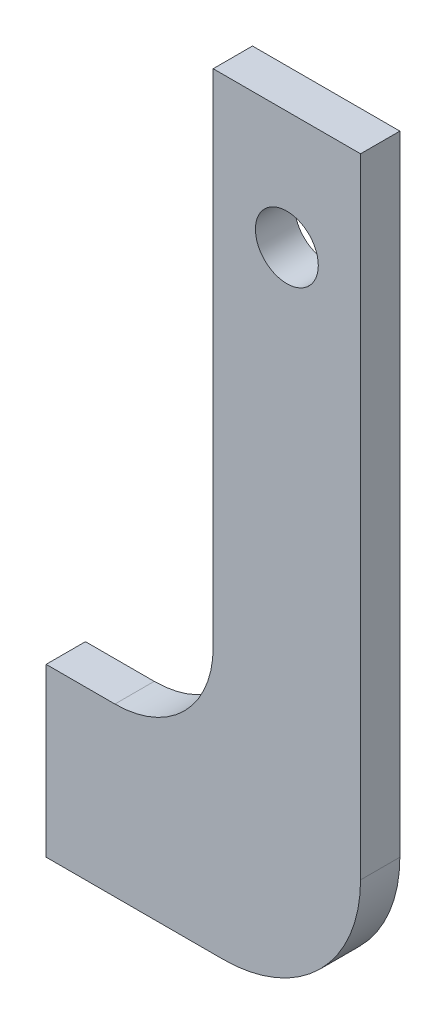
ISO-10303-21;
HEADER;
FILE_DESCRIPTION(('STEP AP214'),'2;1');
FILE_NAME('part.step','',(''),(''),'','','');
FILE_SCHEMA(('AUTOMOTIVE_DESIGN { 1 0 10303 214 1 1 1 1 }'));
ENDSEC;
DATA;
#1=APPLICATION_CONTEXT('core data for automotive mechanical design processes');
#2=APPLICATION_PROTOCOL_DEFINITION('international standard','automotive_design',2000,#1);
#3=PRODUCT_CONTEXT('',#1,'mechanical');
#4=PRODUCT('Part','Part','',(#3));
#5=PRODUCT_RELATED_PRODUCT_CATEGORY('part','',(#4));
#6=PRODUCT_DEFINITION_FORMATION('','',#4);
#7=PRODUCT_DEFINITION_CONTEXT('part definition',#1,'design');
#8=PRODUCT_DEFINITION('design','',#6,#7);
#9=PRODUCT_DEFINITION_SHAPE('','',#8);
#10=(LENGTH_UNIT() NAMED_UNIT(*) SI_UNIT(.MILLI.,.METRE.));
#11=(NAMED_UNIT(*) PLANE_ANGLE_UNIT() SI_UNIT($,.RADIAN.));
#12=(NAMED_UNIT(*) SI_UNIT($,.STERADIAN.) SOLID_ANGLE_UNIT());
#13=UNCERTAINTY_MEASURE_WITH_UNIT(LENGTH_MEASURE(1.E-05),#10,'distance_accuracy_value','');
#14=(GEOMETRIC_REPRESENTATION_CONTEXT(3) GLOBAL_UNCERTAINTY_ASSIGNED_CONTEXT((#13)) GLOBAL_UNIT_ASSIGNED_CONTEXT((#10,
#11,#12)) REPRESENTATION_CONTEXT('',''));
#15=CARTESIAN_POINT('',(0.,0.,0.));
#16=DIRECTION('',(0.,0.,1.));
#17=DIRECTION('',(1.,0.,0.));
#18=AXIS2_PLACEMENT_3D('',#15,#16,#17);
#19=CARTESIAN_POINT('',(0.,-9.7809667673716,2.));
#20=DIRECTION('',(0.,1.,0.));
#21=DIRECTION('',(0.,0.,1.));
#22=AXIS2_PLACEMENT_3D('',#19,#20,#21);
#23=PLANE('',#22);
#24=DIRECTION('',(1.,0.,0.));
#25=VECTOR('',#24,1.);
#26=CARTESIAN_POINT('',(0.,-9.7809667673716,0.));
#27=LINE('',#26,#25);
#28=CARTESIAN_POINT('',(-11.238670694864,-9.7809667673716,0.));
#29=VERTEX_POINT('',#28);
#30=CARTESIAN_POINT('',(-2.2386706948641,-9.7809667673716,0.));
#31=VERTEX_POINT('',#30);
#32=EDGE_CURVE('E143',#29,#31,#27,.T.);
#33=ORIENTED_EDGE('',*,*,#32,.T.);
#34=DIRECTION('',(0.,0.,-1.));
#35=VECTOR('',#34,1.);
#36=CARTESIAN_POINT('',(-2.2386706948641,-9.7809667673716,2.));
#37=LINE('',#36,#35);
#38=CARTESIAN_POINT('',(-2.2386706948641,-9.7809667673716,2.));
#39=VERTEX_POINT('',#38);
#40=EDGE_CURVE('E11',#39,#31,#37,.T.);
#41=ORIENTED_EDGE('',*,*,#40,.F.);
#42=DIRECTION('',(1.,0.,0.));
#43=VECTOR('',#42,1.);
#44=CARTESIAN_POINT('',(0.,-9.7809667673716,2.));
#45=LINE('',#44,#43);
#46=CARTESIAN_POINT('',(-11.238670694864,-9.7809667673716,2.));
#47=VERTEX_POINT('',#46);
#48=EDGE_CURVE('E206',#47,#39,#45,.T.);
#49=ORIENTED_EDGE('',*,*,#48,.F.);
#50=DIRECTION('',(0.,0.,-1.));
#51=VECTOR('',#50,1.);
#52=CARTESIAN_POINT('',(-11.238670694864,-9.7809667673716,2.));
#53=LINE('',#52,#51);
#54=EDGE_CURVE('E135',#47,#29,#53,.T.);
#55=ORIENTED_EDGE('',*,*,#54,.T.);
#56=EDGE_LOOP('',(#33,#41,#49,#55));
#57=FACE_BOUND('',#56,.T.);
#58=ADVANCED_FACE('F39',(#57),#23,.F.);
#59=CARTESIAN_POINT('',(-2.23867069486405,-2.7809667673716,2.));
#60=DIRECTION('',(0.,0.,-1.));
#61=DIRECTION('',(-1.,0.,0.));
#62=AXIS2_PLACEMENT_3D('',#59,#60,#61);
#63=CYLINDRICAL_SURFACE('',#62,7.);
#64=CARTESIAN_POINT('',(-2.23867069486405,-2.7809667673716,0.));
#65=DIRECTION('',(0.,0.,1.));
#66=DIRECTION('',(1.,0.,0.));
#67=AXIS2_PLACEMENT_3D('',#64,#65,#66);
#68=CIRCLE('',#67,7.);
#69=CARTESIAN_POINT('',(4.76132930513595,-2.78096676737155,0.));
#70=VERTEX_POINT('',#69);
#71=EDGE_CURVE('E147',#31,#70,#68,.T.);
#72=ORIENTED_EDGE('',*,*,#71,.T.);
#73=DIRECTION('',(0.,0.,-1.));
#74=VECTOR('',#73,1.);
#75=CARTESIAN_POINT('',(4.76132930513595,-2.78096676737155,2.));
#76=LINE('',#75,#74);
#77=CARTESIAN_POINT('',(4.76132930513595,-2.78096676737155,2.));
#78=VERTEX_POINT('',#77);
#79=EDGE_CURVE('E49',#78,#70,#76,.T.);
#80=ORIENTED_EDGE('',*,*,#79,.F.);
#81=CARTESIAN_POINT('',(-2.23867069486405,-2.7809667673716,2.));
#82=DIRECTION('',(0.,0.,1.));
#83=DIRECTION('',(1.,0.,0.));
#84=AXIS2_PLACEMENT_3D('',#81,#82,#83);
#85=CIRCLE('',#84,7.);
#86=EDGE_CURVE('E96',#39,#78,#85,.T.);
#87=ORIENTED_EDGE('',*,*,#86,.F.);
#88=ORIENTED_EDGE('',*,*,#40,.T.);
#89=EDGE_LOOP('',(#72,#80,#87,#88));
#90=FACE_BOUND('',#89,.T.);
#91=ADVANCED_FACE('F189',(#90),#63,.T.);
#92=CARTESIAN_POINT('',(4.76132930513595,0.,2.));
#93=DIRECTION('',(1.,0.,0.));
#94=DIRECTION('',(0.,0.,-1.));
#95=AXIS2_PLACEMENT_3D('',#92,#93,#94);
#96=PLANE('',#95);
#97=DIRECTION('',(0.,-1.,0.));
#98=VECTOR('',#97,1.);
#99=CARTESIAN_POINT('',(4.76132930513595,0.,0.));
#100=LINE('',#99,#98);
#101=CARTESIAN_POINT('',(4.76132930513595,29.2190332326284,0.));
#102=VERTEX_POINT('',#101);
#103=EDGE_CURVE('E151',#102,#70,#100,.T.);
#104=ORIENTED_EDGE('',*,*,#103,.F.);
#105=DIRECTION('',(0.,0.,-1.));
#106=VECTOR('',#105,1.);
#107=CARTESIAN_POINT('',(4.76132930513595,29.2190332326284,2.));
#108=LINE('',#107,#106);
#109=CARTESIAN_POINT('',(4.76132930513595,29.2190332326284,2.));
#110=VERTEX_POINT('',#109);
#111=EDGE_CURVE('E180',#110,#102,#108,.T.);
#112=ORIENTED_EDGE('',*,*,#111,.F.);
#113=DIRECTION('',(0.,-1.,0.));
#114=VECTOR('',#113,1.);
#115=CARTESIAN_POINT('',(4.76132930513595,0.,2.));
#116=LINE('',#115,#114);
#117=EDGE_CURVE('E188',#110,#78,#116,.T.);
#118=ORIENTED_EDGE('',*,*,#117,.T.);
#119=ORIENTED_EDGE('',*,*,#79,.T.);
#120=EDGE_LOOP('',(#104,#112,#118,#119));
#121=FACE_BOUND('',#120,.T.);
#122=ADVANCED_FACE('F186',(#121),#96,.T.);
#123=CARTESIAN_POINT('',(0.,29.2190332326284,2.));
#124=DIRECTION('',(0.,-1.,0.));
#125=DIRECTION('',(0.,0.,-1.));
#126=AXIS2_PLACEMENT_3D('',#123,#124,#125);
#127=PLANE('',#126);
#128=DIRECTION('',(-1.,0.,0.));
#129=VECTOR('',#128,1.);
#130=CARTESIAN_POINT('',(0.,29.2190332326284,0.));
#131=LINE('',#130,#129);
#132=CARTESIAN_POINT('',(-2.73867069486405,29.2190332326284,0.));
#133=VERTEX_POINT('',#132);
#134=EDGE_CURVE('E155',#102,#133,#131,.T.);
#135=ORIENTED_EDGE('',*,*,#134,.T.);
#136=DIRECTION('',(0.,0.,-1.));
#137=VECTOR('',#136,1.);
#138=CARTESIAN_POINT('',(-2.73867069486405,29.2190332326284,2.));
#139=LINE('',#138,#137);
#140=CARTESIAN_POINT('',(-2.73867069486405,29.2190332326284,2.));
#141=VERTEX_POINT('',#140);
#142=EDGE_CURVE('E177',#141,#133,#139,.T.);
#143=ORIENTED_EDGE('',*,*,#142,.F.);
#144=DIRECTION('',(-1.,0.,0.));
#145=VECTOR('',#144,1.);
#146=CARTESIAN_POINT('',(0.,29.2190332326284,2.));
#147=LINE('',#146,#145);
#148=EDGE_CURVE('E200',#110,#141,#147,.T.);
#149=ORIENTED_EDGE('',*,*,#148,.F.);
#150=ORIENTED_EDGE('',*,*,#111,.T.);
#151=EDGE_LOOP('',(#135,#143,#149,#150));
#152=FACE_BOUND('',#151,.T.);
#153=ADVANCED_FACE('F198',(#152),#127,.F.);
#154=CARTESIAN_POINT('',(-2.73867069486405,0.,2.));
#155=DIRECTION('',(-1.,0.,0.));
#156=DIRECTION('',(0.,0.,1.));
#157=AXIS2_PLACEMENT_3D('',#154,#155,#156);
#158=PLANE('',#157);
#159=DIRECTION('',(0.,1.,0.));
#160=VECTOR('',#159,1.);
#161=CARTESIAN_POINT('',(-2.73867069486405,0.,0.));
#162=LINE('',#161,#160);
#163=CARTESIAN_POINT('',(-2.73867069486405,3.71903323262843,0.));
#164=VERTEX_POINT('',#163);
#165=EDGE_CURVE('E159',#164,#133,#162,.T.);
#166=ORIENTED_EDGE('',*,*,#165,.F.);
#167=DIRECTION('',(0.,0.,-1.));
#168=VECTOR('',#167,1.);
#169=CARTESIAN_POINT('',(-2.73867069486405,3.71903323262843,2.));
#170=LINE('',#169,#168);
#171=CARTESIAN_POINT('',(-2.73867069486405,3.71903323262843,2.));
#172=VERTEX_POINT('',#171);
#173=EDGE_CURVE('E122',#172,#164,#170,.T.);
#174=ORIENTED_EDGE('',*,*,#173,.F.);
#175=DIRECTION('',(0.,1.,0.));
#176=VECTOR('',#175,1.);
#177=CARTESIAN_POINT('',(-2.73867069486405,0.,2.));
#178=LINE('',#177,#176);
#179=EDGE_CURVE('E128',#172,#141,#178,.T.);
#180=ORIENTED_EDGE('',*,*,#179,.T.);
#181=ORIENTED_EDGE('',*,*,#142,.T.);
#182=EDGE_LOOP('',(#166,#174,#180,#181));
#183=FACE_BOUND('',#182,.T.);
#184=ADVANCED_FACE('F211',(#183),#158,.T.);
#185=CARTESIAN_POINT('',(-7.73867069486405,3.7190332326284,2.));
#186=DIRECTION('',(0.,0.,-1.));
#187=DIRECTION('',(-1.,0.,0.));
#188=AXIS2_PLACEMENT_3D('',#185,#186,#187);
#189=CYLINDRICAL_SURFACE('',#188,5.);
#190=CARTESIAN_POINT('',(-7.73867069486405,3.7190332326284,0.));
#191=DIRECTION('',(0.,0.,1.));
#192=DIRECTION('',(1.,0.,0.));
#193=AXIS2_PLACEMENT_3D('',#190,#191,#192);
#194=CIRCLE('',#193,5.);
#195=CARTESIAN_POINT('',(-7.73867069486408,-1.2809667673716,0.));
#196=VERTEX_POINT('',#195);
#197=EDGE_CURVE('E116',#196,#164,#194,.T.);
#198=ORIENTED_EDGE('',*,*,#197,.F.);
#199=DIRECTION('',(0.,0.,-1.));
#200=VECTOR('',#199,1.);
#201=CARTESIAN_POINT('',(-7.73867069486408,-1.2809667673716,2.));
#202=LINE('',#201,#200);
#203=CARTESIAN_POINT('',(-7.73867069486408,-1.2809667673716,2.));
#204=VERTEX_POINT('',#203);
#205=EDGE_CURVE('E111',#204,#196,#202,.T.);
#206=ORIENTED_EDGE('',*,*,#205,.F.);
#207=CARTESIAN_POINT('',(-7.73867069486405,3.7190332326284,2.));
#208=DIRECTION('',(0.,0.,1.));
#209=DIRECTION('',(1.,0.,0.));
#210=AXIS2_PLACEMENT_3D('',#207,#208,#209);
#211=CIRCLE('',#210,5.);
#212=EDGE_CURVE('E114',#204,#172,#211,.T.);
#213=ORIENTED_EDGE('',*,*,#212,.T.);
#214=ORIENTED_EDGE('',*,*,#173,.T.);
#215=EDGE_LOOP('',(#198,#206,#213,#214));
#216=FACE_BOUND('',#215,.T.);
#217=ADVANCED_FACE('F113',(#216),#189,.F.);
#218=CARTESIAN_POINT('',(0.,-1.2809667673716,2.));
#219=DIRECTION('',(0.,1.,0.));
#220=DIRECTION('',(0.,0.,1.));
#221=AXIS2_PLACEMENT_3D('',#218,#219,#220);
#222=PLANE('',#221);
#223=DIRECTION('',(1.,0.,0.));
#224=VECTOR('',#223,1.);
#225=CARTESIAN_POINT('',(0.,-1.2809667673716,0.));
#226=LINE('',#225,#224);
#227=CARTESIAN_POINT('',(-11.238670694864,-1.2809667673716,0.));
#228=VERTEX_POINT('',#227);
#229=EDGE_CURVE('E165',#228,#196,#226,.T.);
#230=ORIENTED_EDGE('',*,*,#229,.F.);
#231=DIRECTION('',(0.,0.,-1.));
#232=VECTOR('',#231,1.);
#233=CARTESIAN_POINT('',(-11.238670694864,-1.2809667673716,2.));
#234=LINE('',#233,#232);
#235=CARTESIAN_POINT('',(-11.238670694864,-1.2809667673716,2.));
#236=VERTEX_POINT('',#235);
#237=EDGE_CURVE('E85',#236,#228,#234,.T.);
#238=ORIENTED_EDGE('',*,*,#237,.F.);
#239=DIRECTION('',(1.,0.,0.));
#240=VECTOR('',#239,1.);
#241=CARTESIAN_POINT('',(0.,-1.2809667673716,2.));
#242=LINE('',#241,#240);
#243=EDGE_CURVE('E126',#236,#204,#242,.T.);
#244=ORIENTED_EDGE('',*,*,#243,.T.);
#245=ORIENTED_EDGE('',*,*,#205,.T.);
#246=EDGE_LOOP('',(#230,#238,#244,#245));
#247=FACE_BOUND('',#246,.T.);
#248=ADVANCED_FACE('F131',(#247),#222,.T.);
#249=CARTESIAN_POINT('',(1.01132930513595,23.2190332326284,2.));
#250=DIRECTION('',(0.,0.,-1.));
#251=DIRECTION('',(-1.,0.,0.));
#252=AXIS2_PLACEMENT_3D('',#249,#250,#251);
#253=CYLINDRICAL_SURFACE('',#252,1.6);
#254=CARTESIAN_POINT('',(1.01132930513595,23.2190332326284,2.));
#255=DIRECTION('',(0.,0.,1.));
#256=DIRECTION('',(1.,0.,0.));
#257=AXIS2_PLACEMENT_3D('',#254,#255,#256);
#258=CIRCLE('',#257,1.6);
#259=CARTESIAN_POINT('',(2.61132930513595,23.2190332326284,2.));
#260=VERTEX_POINT('',#259);
#261=EDGE_CURVE('E170',#260,#260,#258,.T.);
#262=ORIENTED_EDGE('',*,*,#261,.T.);
#263=EDGE_LOOP('',(#262));
#264=FACE_BOUND('',#263,.T.);
#265=CARTESIAN_POINT('',(1.01132930513595,23.2190332326284,0.));
#266=DIRECTION('',(0.,0.,1.));
#267=DIRECTION('',(1.,0.,0.));
#268=AXIS2_PLACEMENT_3D('',#265,#266,#267);
#269=CIRCLE('',#268,1.6);
#270=CARTESIAN_POINT('',(2.61132930513595,23.2190332326284,0.));
#271=VERTEX_POINT('',#270);
#272=EDGE_CURVE('E139',#271,#271,#269,.T.);
#273=ORIENTED_EDGE('',*,*,#272,.F.);
#274=EDGE_LOOP('',(#273));
#275=FACE_BOUND('',#274,.T.);
#276=ADVANCED_FACE('F41',(#264,#275),#253,.F.);
#277=CARTESIAN_POINT('',(-11.238670694864,0.,2.));
#278=DIRECTION('',(1.,0.,0.));
#279=DIRECTION('',(0.,1.,0.));
#280=AXIS2_PLACEMENT_3D('',#277,#278,#279);
#281=PLANE('',#280);
#282=DIRECTION('',(0.,-1.,0.));
#283=VECTOR('',#282,1.);
#284=CARTESIAN_POINT('',(-11.238670694864,0.,0.));
#285=LINE('',#284,#283);
#286=EDGE_CURVE('E88',#228,#29,#285,.T.);
#287=ORIENTED_EDGE('',*,*,#286,.T.);
#288=ORIENTED_EDGE('',*,*,#54,.F.);
#289=DIRECTION('',(0.,-1.,0.));
#290=VECTOR('',#289,1.);
#291=CARTESIAN_POINT('',(-11.238670694864,0.,2.));
#292=LINE('',#291,#290);
#293=EDGE_CURVE('E57',#236,#47,#292,.T.);
#294=ORIENTED_EDGE('',*,*,#293,.F.);
#295=ORIENTED_EDGE('',*,*,#237,.T.);
#296=EDGE_LOOP('',(#287,#288,#294,#295));
#297=FACE_BOUND('',#296,.T.);
#298=ADVANCED_FACE('F214',(#297),#281,.F.);
#299=CARTESIAN_POINT('',(0.,0.,2.));
#300=DIRECTION('',(0.,0.,1.));
#301=DIRECTION('',(1.,0.,0.));
#302=AXIS2_PLACEMENT_3D('',#299,#300,#301);
#303=PLANE('',#302);
#304=ORIENTED_EDGE('',*,*,#261,.F.);
#305=EDGE_LOOP('',(#304));
#306=FACE_BOUND('',#305,.T.);
#307=ORIENTED_EDGE('',*,*,#48,.T.);
#308=ORIENTED_EDGE('',*,*,#86,.T.);
#309=ORIENTED_EDGE('',*,*,#117,.F.);
#310=ORIENTED_EDGE('',*,*,#148,.T.);
#311=ORIENTED_EDGE('',*,*,#179,.F.);
#312=ORIENTED_EDGE('',*,*,#212,.F.);
#313=ORIENTED_EDGE('',*,*,#243,.F.);
#314=ORIENTED_EDGE('',*,*,#293,.T.);
#315=EDGE_LOOP('',(#307,#308,#309,#310,#311,#312,#313,#314));
#316=FACE_BOUND('',#315,.T.);
#317=ADVANCED_FACE('F125',(#306,#316),#303,.T.);
#318=CARTESIAN_POINT('',(0.,0.,0.));
#319=DIRECTION('',(0.,0.,1.));
#320=DIRECTION('',(1.,0.,0.));
#321=AXIS2_PLACEMENT_3D('',#318,#319,#320);
#322=PLANE('',#321);
#323=ORIENTED_EDGE('',*,*,#272,.T.);
#324=EDGE_LOOP('',(#323));
#325=FACE_BOUND('',#324,.T.);
#326=ORIENTED_EDGE('',*,*,#32,.F.);
#327=ORIENTED_EDGE('',*,*,#286,.F.);
#328=ORIENTED_EDGE('',*,*,#229,.T.);
#329=ORIENTED_EDGE('',*,*,#197,.T.);
#330=ORIENTED_EDGE('',*,*,#165,.T.);
#331=ORIENTED_EDGE('',*,*,#134,.F.);
#332=ORIENTED_EDGE('',*,*,#103,.T.);
#333=ORIENTED_EDGE('',*,*,#71,.F.);
#334=EDGE_LOOP('',(#326,#327,#328,#329,#330,#331,#332,#333));
#335=FACE_BOUND('',#334,.T.);
#336=ADVANCED_FACE('F194',(#325,#335),#322,.F.);
#337=CLOSED_SHELL('',(#58,#91,#122,#153,#184,#217,#248,#276,#298,#317,#336));
#338=MANIFOLD_SOLID_BREP('B2',#337);
#339=ADVANCED_BREP_SHAPE_REPRESENTATION('',(#18,#338),#14);
#340=SHAPE_DEFINITION_REPRESENTATION(#9,#339);
ENDSEC;
END-ISO-10303-21;
